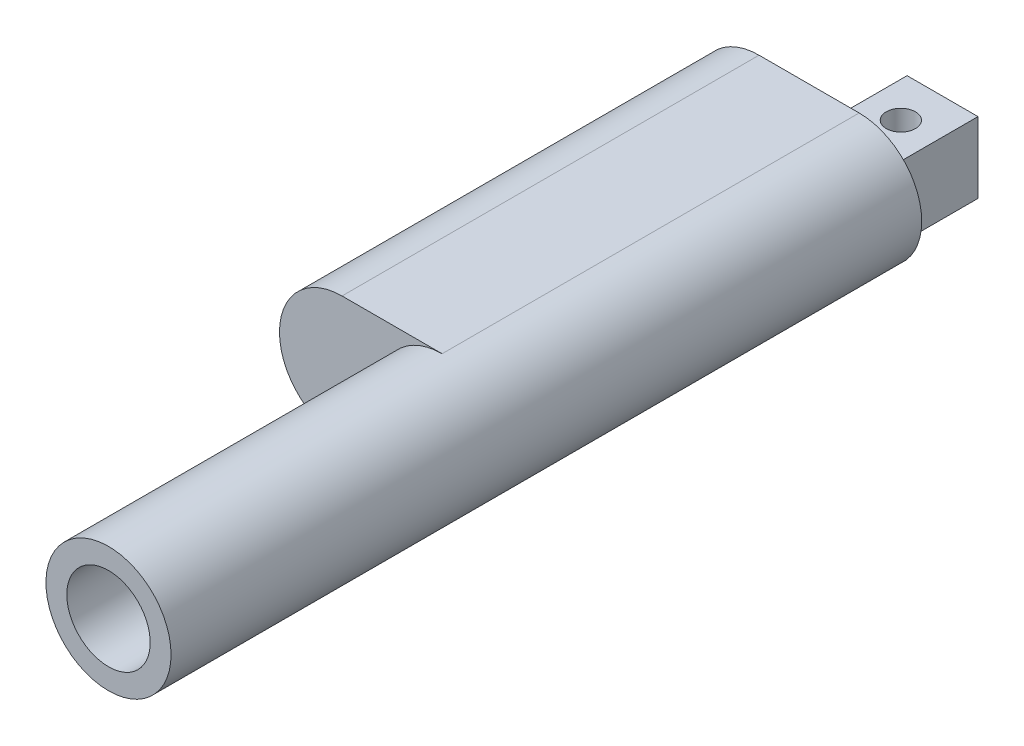
ISO-10303-21;
HEADER;
FILE_DESCRIPTION(('STEP AP214'),'2;1');
FILE_NAME('part.step','',(''),(''),'','','');
FILE_SCHEMA(('AUTOMOTIVE_DESIGN { 1 0 10303 214 1 1 1 1 }'));
ENDSEC;
DATA;
#1=APPLICATION_CONTEXT('core data for automotive mechanical design processes');
#2=APPLICATION_PROTOCOL_DEFINITION('international standard','automotive_design',2000,#1);
#3=PRODUCT_CONTEXT('',#1,'mechanical');
#4=PRODUCT('Part','Part','',(#3));
#5=PRODUCT_RELATED_PRODUCT_CATEGORY('part','',(#4));
#6=PRODUCT_DEFINITION_FORMATION('','',#4);
#7=PRODUCT_DEFINITION_CONTEXT('part definition',#1,'design');
#8=PRODUCT_DEFINITION('design','',#6,#7);
#9=PRODUCT_DEFINITION_SHAPE('','',#8);
#10=(LENGTH_UNIT() NAMED_UNIT(*) SI_UNIT(.MILLI.,.METRE.));
#11=(NAMED_UNIT(*) PLANE_ANGLE_UNIT() SI_UNIT($,.RADIAN.));
#12=(NAMED_UNIT(*) SI_UNIT($,.STERADIAN.) SOLID_ANGLE_UNIT());
#13=UNCERTAINTY_MEASURE_WITH_UNIT(LENGTH_MEASURE(1.E-05),#10,'distance_accuracy_value','');
#14=(GEOMETRIC_REPRESENTATION_CONTEXT(3) GLOBAL_UNCERTAINTY_ASSIGNED_CONTEXT((#13)) GLOBAL_UNIT_ASSIGNED_CONTEXT((#10,
#11,#12)) REPRESENTATION_CONTEXT('',''));
#15=CARTESIAN_POINT('',(0.,0.,0.));
#16=DIRECTION('',(0.,0.,1.));
#17=DIRECTION('',(1.,0.,0.));
#18=AXIS2_PLACEMENT_3D('',#15,#16,#17);
#19=CARTESIAN_POINT('',(0.,0.,0.));
#20=DIRECTION('',(0.,0.,1.));
#21=DIRECTION('',(1.,0.,0.));
#22=AXIS2_PLACEMENT_3D('',#19,#20,#21);
#23=PLANE('',#22);
#24=CARTESIAN_POINT('',(0.,0.,0.));
#25=DIRECTION('',(0.,0.,1.));
#26=DIRECTION('',(1.,0.,0.));
#27=AXIS2_PLACEMENT_3D('',#24,#25,#26);
#28=CIRCLE('',#27,15.);
#29=CARTESIAN_POINT('',(0.,-15.,0.));
#30=VERTEX_POINT('',#29);
#31=CARTESIAN_POINT('',(0.,15.,0.));
#32=VERTEX_POINT('',#31);
#33=EDGE_CURVE('E50',#30,#32,#28,.T.);
#34=ORIENTED_EDGE('',*,*,#33,.F.);
#35=DIRECTION('',(-1.,0.,0.));
#36=VECTOR('',#35,1.);
#37=CARTESIAN_POINT('',(0.,-15.,0.));
#38=LINE('',#37,#36);
#39=CARTESIAN_POINT('',(-24.,-15.,0.));
#40=VERTEX_POINT('',#39);
#41=EDGE_CURVE('E128',#30,#40,#38,.T.);
#42=ORIENTED_EDGE('',*,*,#41,.T.);
#43=CARTESIAN_POINT('',(-24.,0.,0.));
#44=DIRECTION('',(0.,0.,-1.));
#45=DIRECTION('',(-1.,0.,0.));
#46=AXIS2_PLACEMENT_3D('',#43,#44,#45);
#47=CIRCLE('',#46,15.);
#48=CARTESIAN_POINT('',(-24.,15.,0.));
#49=VERTEX_POINT('',#48);
#50=EDGE_CURVE('E131',#40,#49,#47,.T.);
#51=ORIENTED_EDGE('',*,*,#50,.T.);
#52=DIRECTION('',(1.,0.,0.));
#53=VECTOR('',#52,1.);
#54=CARTESIAN_POINT('',(0.,15.,0.));
#55=LINE('',#54,#53);
#56=EDGE_CURVE('E141',#49,#32,#55,.T.);
#57=ORIENTED_EDGE('',*,*,#56,.T.);
#58=EDGE_LOOP('',(#34,#42,#51,#57));
#59=FACE_BOUND('',#58,.T.);
#60=DIRECTION('',(0.,-1.,0.));
#61=VECTOR('',#60,1.);
#62=CARTESIAN_POINT('',(8.5,8.5,0.));
#63=LINE('',#62,#61);
#64=CARTESIAN_POINT('',(8.5,8.5,0.));
#65=VERTEX_POINT('',#64);
#66=CARTESIAN_POINT('',(8.5,-8.5,0.));
#67=VERTEX_POINT('',#66);
#68=EDGE_CURVE('E58',#65,#67,#63,.T.);
#69=ORIENTED_EDGE('',*,*,#68,.F.);
#70=DIRECTION('',(1.,0.,0.));
#71=VECTOR('',#70,1.);
#72=CARTESIAN_POINT('',(8.5,8.5,0.));
#73=LINE('',#72,#71);
#74=CARTESIAN_POINT('',(-8.5,8.5,0.));
#75=VERTEX_POINT('',#74);
#76=EDGE_CURVE('E62',#75,#65,#73,.T.);
#77=ORIENTED_EDGE('',*,*,#76,.F.);
#78=DIRECTION('',(0.,1.,0.));
#79=VECTOR('',#78,1.);
#80=CARTESIAN_POINT('',(-8.5,8.5,0.));
#81=LINE('',#80,#79);
#82=CARTESIAN_POINT('',(-8.5,-8.5,0.));
#83=VERTEX_POINT('',#82);
#84=EDGE_CURVE('E254',#83,#75,#81,.T.);
#85=ORIENTED_EDGE('',*,*,#84,.F.);
#86=DIRECTION('',(-1.,0.,0.));
#87=VECTOR('',#86,1.);
#88=CARTESIAN_POINT('',(8.5,-8.5,0.));
#89=LINE('',#88,#87);
#90=EDGE_CURVE('E246',#67,#83,#89,.T.);
#91=ORIENTED_EDGE('',*,*,#90,.F.);
#92=EDGE_LOOP('',(#69,#77,#85,#91));
#93=FACE_BOUND('',#92,.T.);
#94=ADVANCED_FACE('F41',(#59,#93),#23,.F.);
#95=CARTESIAN_POINT('',(0.,0.,180.));
#96=DIRECTION('',(0.,0.,-1.));
#97=DIRECTION('',(-1.,0.,0.));
#98=AXIS2_PLACEMENT_3D('',#95,#96,#97);
#99=CYLINDRICAL_SURFACE('',#98,15.);
#100=CARTESIAN_POINT('',(0.,0.,180.));
#101=DIRECTION('',(0.,0.,1.));
#102=DIRECTION('',(1.,0.,0.));
#103=AXIS2_PLACEMENT_3D('',#100,#101,#102);
#104=CIRCLE('',#103,15.);
#105=CARTESIAN_POINT('',(15.,0.,180.));
#106=VERTEX_POINT('',#105);
#107=EDGE_CURVE('E11',#106,#106,#104,.T.);
#108=ORIENTED_EDGE('',*,*,#107,.F.);
#109=EDGE_LOOP('',(#108));
#110=FACE_BOUND('',#109,.T.);
#111=CARTESIAN_POINT('',(0.,0.,100.));
#112=DIRECTION('',(0.,0.,-1.));
#113=DIRECTION('',(-1.,0.,0.));
#114=AXIS2_PLACEMENT_3D('',#111,#112,#113);
#115=CIRCLE('',#114,15.);
#116=CARTESIAN_POINT('',(0.,-15.,100.));
#117=VERTEX_POINT('',#116);
#118=CARTESIAN_POINT('',(0.,15.,100.));
#119=VERTEX_POINT('',#118);
#120=EDGE_CURVE('E161',#117,#119,#115,.T.);
#121=ORIENTED_EDGE('',*,*,#120,.F.);
#122=DIRECTION('',(0.,0.,-1.));
#123=VECTOR('',#122,1.);
#124=CARTESIAN_POINT('',(0.,-15.,100.));
#125=LINE('',#124,#123);
#126=EDGE_CURVE('E146',#117,#30,#125,.T.);
#127=ORIENTED_EDGE('',*,*,#126,.T.);
#128=ORIENTED_EDGE('',*,*,#33,.T.);
#129=DIRECTION('',(0.,0.,-1.));
#130=VECTOR('',#129,1.);
#131=CARTESIAN_POINT('',(0.,15.,100.));
#132=LINE('',#131,#130);
#133=EDGE_CURVE('E152',#119,#32,#132,.T.);
#134=ORIENTED_EDGE('',*,*,#133,.F.);
#135=EDGE_LOOP('',(#121,#127,#128,#134));
#136=FACE_BOUND('',#135,.T.);
#137=ADVANCED_FACE('F43',(#110,#136),#99,.T.);
#138=CARTESIAN_POINT('',(0.,0.,180.));
#139=DIRECTION('',(0.,0.,-1.));
#140=DIRECTION('',(-1.,0.,0.));
#141=AXIS2_PLACEMENT_3D('',#138,#139,#140);
#142=CYLINDRICAL_SURFACE('',#141,10.);
#143=CARTESIAN_POINT('',(0.,0.,180.));
#144=DIRECTION('',(0.,0.,1.));
#145=DIRECTION('',(1.,0.,0.));
#146=AXIS2_PLACEMENT_3D('',#143,#144,#145);
#147=CIRCLE('',#146,10.);
#148=CARTESIAN_POINT('',(-10.,0.,180.));
#149=VERTEX_POINT('',#148);
#150=EDGE_CURVE('E164',#149,#149,#147,.T.);
#151=CARTESIAN_POINT('',(0.,0.,100.));
#152=DIRECTION('',(0.,0.,-1.));
#153=DIRECTION('',(-1.,0.,0.));
#154=AXIS2_PLACEMENT_3D('',#151,#152,#153);
#155=CIRCLE('',#154,10.);
#156=CARTESIAN_POINT('',(-10.,0.,100.));
#157=VERTEX_POINT('',#156);
#158=EDGE_CURVE('E45',#157,#157,#155,.T.);
#159=CARTESIAN_POINT('',(-10.,0.,180.));
#160=CARTESIAN_POINT('',(-10.,0.,179.166666666667));
#161=CARTESIAN_POINT('',(-10.,0.,178.333333333333));
#162=CARTESIAN_POINT('',(-10.,0.,176.666666666667));
#163=CARTESIAN_POINT('',(-10.,0.,175.833333333333));
#164=CARTESIAN_POINT('',(-10.,0.,174.166666666667));
#165=CARTESIAN_POINT('',(-10.,0.,173.333333333333));
#166=CARTESIAN_POINT('',(-10.,0.,171.666666666667));
#167=CARTESIAN_POINT('',(-10.,0.,170.833333333333));
#168=CARTESIAN_POINT('',(-10.,0.,169.166666666667));
#169=CARTESIAN_POINT('',(-10.,0.,168.333333333333));
#170=CARTESIAN_POINT('',(-10.,0.,166.666666666667));
#171=CARTESIAN_POINT('',(-10.,0.,165.833333333333));
#172=CARTESIAN_POINT('',(-10.,0.,164.166666666667));
#173=CARTESIAN_POINT('',(-10.,0.,163.333333333333));
#174=CARTESIAN_POINT('',(-10.,0.,161.666666666667));
#175=CARTESIAN_POINT('',(-10.,0.,160.833333333333));
#176=CARTESIAN_POINT('',(-10.,0.,159.166666666667));
#177=CARTESIAN_POINT('',(-10.,0.,158.333333333333));
#178=CARTESIAN_POINT('',(-10.,0.,156.666666666667));
#179=CARTESIAN_POINT('',(-10.,0.,155.833333333333));
#180=CARTESIAN_POINT('',(-10.,0.,154.166666666667));
#181=CARTESIAN_POINT('',(-10.,0.,153.333333333333));
#182=CARTESIAN_POINT('',(-10.,0.,151.666666666667));
#183=CARTESIAN_POINT('',(-10.,0.,150.833333333333));
#184=CARTESIAN_POINT('',(-10.,0.,149.166666666667));
#185=CARTESIAN_POINT('',(-10.,0.,148.333333333333));
#186=CARTESIAN_POINT('',(-10.,0.,146.666666666667));
#187=CARTESIAN_POINT('',(-10.,0.,145.833333333333));
#188=CARTESIAN_POINT('',(-10.,0.,144.166666666667));
#189=CARTESIAN_POINT('',(-10.,0.,143.333333333333));
#190=CARTESIAN_POINT('',(-10.,0.,141.666666666667));
#191=CARTESIAN_POINT('',(-10.,0.,140.833333333333));
#192=CARTESIAN_POINT('',(-10.,0.,139.166666666667));
#193=CARTESIAN_POINT('',(-10.,0.,138.333333333333));
#194=CARTESIAN_POINT('',(-10.,0.,136.666666666667));
#195=CARTESIAN_POINT('',(-10.,0.,135.833333333333));
#196=CARTESIAN_POINT('',(-10.,0.,134.166666666667));
#197=CARTESIAN_POINT('',(-10.,0.,133.333333333333));
#198=CARTESIAN_POINT('',(-10.,0.,131.666666666667));
#199=CARTESIAN_POINT('',(-10.,0.,130.833333333333));
#200=CARTESIAN_POINT('',(-10.,0.,129.166666666667));
#201=CARTESIAN_POINT('',(-10.,0.,128.333333333333));
#202=CARTESIAN_POINT('',(-10.,0.,126.666666666667));
#203=CARTESIAN_POINT('',(-10.,0.,125.833333333333));
#204=CARTESIAN_POINT('',(-10.,0.,124.166666666667));
#205=CARTESIAN_POINT('',(-10.,0.,123.333333333333));
#206=CARTESIAN_POINT('',(-10.,0.,121.666666666667));
#207=CARTESIAN_POINT('',(-10.,0.,120.833333333333));
#208=CARTESIAN_POINT('',(-10.,0.,119.166666666667));
#209=CARTESIAN_POINT('',(-10.,0.,118.333333333333));
#210=CARTESIAN_POINT('',(-10.,0.,116.666666666667));
#211=CARTESIAN_POINT('',(-10.,0.,115.833333333333));
#212=CARTESIAN_POINT('',(-10.,0.,114.166666666667));
#213=CARTESIAN_POINT('',(-10.,0.,113.333333333333));
#214=CARTESIAN_POINT('',(-10.,0.,111.666666666667));
#215=CARTESIAN_POINT('',(-10.,0.,110.833333333333));
#216=CARTESIAN_POINT('',(-10.,0.,109.166666666667));
#217=CARTESIAN_POINT('',(-10.,0.,108.333333333333));
#218=CARTESIAN_POINT('',(-10.,0.,106.666666666667));
#219=CARTESIAN_POINT('',(-10.,0.,105.833333333333));
#220=CARTESIAN_POINT('',(-10.,0.,104.166666666667));
#221=CARTESIAN_POINT('',(-10.,0.,103.333333333333));
#222=CARTESIAN_POINT('',(-10.,0.,101.666666666667));
#223=CARTESIAN_POINT('',(-10.,0.,100.833333333333));
#224=CARTESIAN_POINT('',(-10.,0.,100.));
#225=B_SPLINE_CURVE_WITH_KNOTS('',3,(#159,#160,#161,#162,#163,#164,#165,#166,#167,#168,#169,
#170,#171,#172,#173,#174,#175,#176,#177,#178,#179,#180,#181,#182,#183,#184,#185,#186,#187,#188,
#189,#190,#191,#192,#193,#194,#195,#196,#197,#198,#199,#200,#201,#202,#203,#204,#205,#206,#207,
#208,#209,#210,#211,#212,#213,#214,#215,#216,#217,#218,#219,#220,#221,#222,#223,#224),
.UNSPECIFIED.,.F.,.F.,(4,2,2,2,2,2,2,2,2,2,2,2,2,2,2,2,2,2,2,2,2,2,2,2,2,2,2,2,2,2,2,2,4),(0.,
2.5,5.,7.50000000000001,10.,12.5,15.,17.5,20.,22.5,25.,27.5,30.,32.5,35.,37.5,40.,42.5,45.,47.5,
50.,52.5,55.,57.5,60.,62.5,65.,67.5,70.,72.5,75.,77.5,80.),.UNSPECIFIED.);
#226=EDGE_CURVE('BSEAM198',#149,#157,#225,.T.);
#227=ORIENTED_EDGE('',*,*,#150,.T.);
#228=ORIENTED_EDGE('',*,*,#158,.T.);
#229=ORIENTED_EDGE('',*,*,#226,.T.);
#230=ORIENTED_EDGE('',*,*,#226,.F.);
#231=EDGE_LOOP('',(#227,#229,#228,#230));
#232=FACE_BOUND('',#231,.T.);
#233=ADVANCED_FACE('F198',(#232),#142,.F.);
#234=CARTESIAN_POINT('',(0.,0.,180.));
#235=DIRECTION('',(0.,0.,1.));
#236=DIRECTION('',(1.,0.,0.));
#237=AXIS2_PLACEMENT_3D('',#234,#235,#236);
#238=PLANE('',#237);
#239=ORIENTED_EDGE('',*,*,#107,.T.);
#240=EDGE_LOOP('',(#239));
#241=FACE_BOUND('',#240,.T.);
#242=ORIENTED_EDGE('',*,*,#150,.F.);
#243=EDGE_LOOP('',(#242));
#244=FACE_BOUND('',#243,.T.);
#245=ADVANCED_FACE('F201',(#241,#244),#238,.T.);
#246=CARTESIAN_POINT('',(0.,0.,100.));
#247=DIRECTION('',(0.,0.,-1.));
#248=DIRECTION('',(-1.,0.,0.));
#249=AXIS2_PLACEMENT_3D('',#246,#247,#248);
#250=PLANE('',#249);
#251=ORIENTED_EDGE('',*,*,#158,.F.);
#252=EDGE_LOOP('',(#251));
#253=FACE_BOUND('',#252,.T.);
#254=ADVANCED_FACE('F190',(#253),#250,.F.);
#255=CARTESIAN_POINT('',(0.,15.,100.));
#256=DIRECTION('',(0.,1.,0.));
#257=DIRECTION('',(0.,0.,1.));
#258=AXIS2_PLACEMENT_3D('',#255,#256,#257);
#259=PLANE('',#258);
#260=ORIENTED_EDGE('',*,*,#56,.F.);
#261=DIRECTION('',(0.,0.,-1.));
#262=VECTOR('',#261,1.);
#263=CARTESIAN_POINT('',(-24.,15.,100.));
#264=LINE('',#263,#262);
#265=CARTESIAN_POINT('',(-24.,15.,100.));
#266=VERTEX_POINT('',#265);
#267=EDGE_CURVE('E155',#266,#49,#264,.T.);
#268=ORIENTED_EDGE('',*,*,#267,.F.);
#269=DIRECTION('',(1.,0.,0.));
#270=VECTOR('',#269,1.);
#271=CARTESIAN_POINT('',(0.,15.,100.));
#272=LINE('',#271,#270);
#273=EDGE_CURVE('E144',#266,#119,#272,.T.);
#274=ORIENTED_EDGE('',*,*,#273,.T.);
#275=ORIENTED_EDGE('',*,*,#133,.T.);
#276=EDGE_LOOP('',(#260,#268,#274,#275));
#277=FACE_BOUND('',#276,.T.);
#278=ADVANCED_FACE('F172',(#277),#259,.T.);
#279=CARTESIAN_POINT('',(-24.,0.,100.));
#280=DIRECTION('',(0.,0.,-1.));
#281=DIRECTION('',(-1.,0.,0.));
#282=AXIS2_PLACEMENT_3D('',#279,#280,#281);
#283=CYLINDRICAL_SURFACE('',#282,15.);
#284=ORIENTED_EDGE('',*,*,#50,.F.);
#285=DIRECTION('',(0.,0.,-1.));
#286=VECTOR('',#285,1.);
#287=CARTESIAN_POINT('',(-24.,-15.,100.));
#288=LINE('',#287,#286);
#289=CARTESIAN_POINT('',(-24.,-15.,100.));
#290=VERTEX_POINT('',#289);
#291=EDGE_CURVE('E157',#290,#40,#288,.T.);
#292=ORIENTED_EDGE('',*,*,#291,.F.);
#293=CARTESIAN_POINT('',(-24.,0.,100.));
#294=DIRECTION('',(0.,0.,-1.));
#295=DIRECTION('',(-1.,0.,0.));
#296=AXIS2_PLACEMENT_3D('',#293,#294,#295);
#297=CIRCLE('',#296,15.);
#298=EDGE_CURVE('E140',#290,#266,#297,.T.);
#299=ORIENTED_EDGE('',*,*,#298,.T.);
#300=ORIENTED_EDGE('',*,*,#267,.T.);
#301=EDGE_LOOP('',(#284,#292,#299,#300));
#302=FACE_BOUND('',#301,.T.);
#303=ADVANCED_FACE('F176',(#302),#283,.T.);
#304=CARTESIAN_POINT('',(0.,-15.,100.));
#305=DIRECTION('',(0.,-1.,0.));
#306=DIRECTION('',(0.,0.,-1.));
#307=AXIS2_PLACEMENT_3D('',#304,#305,#306);
#308=PLANE('',#307);
#309=ORIENTED_EDGE('',*,*,#41,.F.);
#310=ORIENTED_EDGE('',*,*,#126,.F.);
#311=DIRECTION('',(-1.,0.,0.));
#312=VECTOR('',#311,1.);
#313=CARTESIAN_POINT('',(0.,-15.,100.));
#314=LINE('',#313,#312);
#315=EDGE_CURVE('E137',#117,#290,#314,.T.);
#316=ORIENTED_EDGE('',*,*,#315,.T.);
#317=ORIENTED_EDGE('',*,*,#291,.T.);
#318=EDGE_LOOP('',(#309,#310,#316,#317));
#319=FACE_BOUND('',#318,.T.);
#320=ADVANCED_FACE('F182',(#319),#308,.T.);
#321=ORIENTED_EDGE('',*,*,#315,.F.);
#322=ORIENTED_EDGE('',*,*,#120,.T.);
#323=ORIENTED_EDGE('',*,*,#273,.F.);
#324=ORIENTED_EDGE('',*,*,#298,.F.);
#325=EDGE_LOOP('',(#321,#322,#323,#324));
#326=FACE_BOUND('',#325,.T.);
#327=ADVANCED_FACE('F180',(#326),#250,.F.);
#328=CARTESIAN_POINT('',(8.5,8.5,-20.));
#329=DIRECTION('',(-1.,0.,0.));
#330=DIRECTION('',(0.,-1.,0.));
#331=AXIS2_PLACEMENT_3D('',#328,#329,#330);
#332=PLANE('',#331);
#333=ORIENTED_EDGE('',*,*,#68,.T.);
#334=DIRECTION('',(0.,0.,1.));
#335=VECTOR('',#334,1.);
#336=CARTESIAN_POINT('',(8.5,-8.5,-20.));
#337=LINE('',#336,#335);
#338=CARTESIAN_POINT('',(8.5,-8.5,-20.));
#339=VERTEX_POINT('',#338);
#340=EDGE_CURVE('E111',#339,#67,#337,.T.);
#341=ORIENTED_EDGE('',*,*,#340,.F.);
#342=DIRECTION('',(0.,-1.,0.));
#343=VECTOR('',#342,1.);
#344=CARTESIAN_POINT('',(8.5,8.5,-20.));
#345=LINE('',#344,#343);
#346=CARTESIAN_POINT('',(8.5,8.5,-20.));
#347=VERTEX_POINT('',#346);
#348=EDGE_CURVE('E117',#347,#339,#345,.T.);
#349=ORIENTED_EDGE('',*,*,#348,.F.);
#350=DIRECTION('',(0.,0.,1.));
#351=VECTOR('',#350,1.);
#352=CARTESIAN_POINT('',(8.5,8.5,-20.));
#353=LINE('',#352,#351);
#354=EDGE_CURVE('E251',#347,#65,#353,.T.);
#355=ORIENTED_EDGE('',*,*,#354,.T.);
#356=EDGE_LOOP('',(#333,#341,#349,#355));
#357=FACE_BOUND('',#356,.T.);
#358=ADVANCED_FACE('F127',(#357),#332,.F.);
#359=CARTESIAN_POINT('',(8.5,-8.5,-20.));
#360=DIRECTION('',(0.,1.,0.));
#361=DIRECTION('',(-1.,0.,0.));
#362=AXIS2_PLACEMENT_3D('',#359,#360,#361);
#363=PLANE('',#362);
#364=CARTESIAN_POINT('',(0.,-8.5,-10.));
#365=DIRECTION('',(0.,1.,0.));
#366=DIRECTION('',(-1.,0.,0.));
#367=AXIS2_PLACEMENT_3D('',#364,#365,#366);
#368=CIRCLE('',#367,3.5);
#369=CARTESIAN_POINT('',(-3.5,-8.5,-10.));
#370=VERTEX_POINT('',#369);
#371=EDGE_CURVE('E244',#370,#370,#368,.T.);
#372=ORIENTED_EDGE('',*,*,#371,.T.);
#373=EDGE_LOOP('',(#372));
#374=FACE_BOUND('',#373,.T.);
#375=ORIENTED_EDGE('',*,*,#90,.T.);
#376=DIRECTION('',(0.,0.,1.));
#377=VECTOR('',#376,1.);
#378=CARTESIAN_POINT('',(-8.5,-8.5,-20.));
#379=LINE('',#378,#377);
#380=CARTESIAN_POINT('',(-8.5,-8.5,-20.));
#381=VERTEX_POINT('',#380);
#382=EDGE_CURVE('E113',#381,#83,#379,.T.);
#383=ORIENTED_EDGE('',*,*,#382,.F.);
#384=DIRECTION('',(-1.,0.,0.));
#385=VECTOR('',#384,1.);
#386=CARTESIAN_POINT('',(8.5,-8.5,-20.));
#387=LINE('',#386,#385);
#388=EDGE_CURVE('E106',#339,#381,#387,.T.);
#389=ORIENTED_EDGE('',*,*,#388,.F.);
#390=ORIENTED_EDGE('',*,*,#340,.T.);
#391=EDGE_LOOP('',(#375,#383,#389,#390));
#392=FACE_BOUND('',#391,.T.);
#393=ADVANCED_FACE('F109',(#374,#392),#363,.F.);
#394=CARTESIAN_POINT('',(-8.5,8.5,-20.));
#395=DIRECTION('',(1.,0.,0.));
#396=DIRECTION('',(0.,1.,0.));
#397=AXIS2_PLACEMENT_3D('',#394,#395,#396);
#398=PLANE('',#397);
#399=ORIENTED_EDGE('',*,*,#84,.T.);
#400=DIRECTION('',(0.,0.,1.));
#401=VECTOR('',#400,1.);
#402=CARTESIAN_POINT('',(-8.5,8.5,-20.));
#403=LINE('',#402,#401);
#404=CARTESIAN_POINT('',(-8.5,8.5,-20.));
#405=VERTEX_POINT('',#404);
#406=EDGE_CURVE('E133',#405,#75,#403,.T.);
#407=ORIENTED_EDGE('',*,*,#406,.F.);
#408=DIRECTION('',(0.,1.,0.));
#409=VECTOR('',#408,1.);
#410=CARTESIAN_POINT('',(-8.5,8.5,-20.));
#411=LINE('',#410,#409);
#412=EDGE_CURVE('E116',#381,#405,#411,.T.);
#413=ORIENTED_EDGE('',*,*,#412,.F.);
#414=ORIENTED_EDGE('',*,*,#382,.T.);
#415=EDGE_LOOP('',(#399,#407,#413,#414));
#416=FACE_BOUND('',#415,.T.);
#417=ADVANCED_FACE('F222',(#416),#398,.F.);
#418=CARTESIAN_POINT('',(8.5,8.5,-20.));
#419=DIRECTION('',(0.,-1.,0.));
#420=DIRECTION('',(1.,0.,0.));
#421=AXIS2_PLACEMENT_3D('',#418,#419,#420);
#422=PLANE('',#421);
#423=CARTESIAN_POINT('',(0.,8.5,-10.));
#424=DIRECTION('',(0.,1.,0.));
#425=DIRECTION('',(-1.,0.,0.));
#426=AXIS2_PLACEMENT_3D('',#423,#424,#425);
#427=CIRCLE('',#426,3.5);
#428=CARTESIAN_POINT('',(-3.5,8.5,-10.));
#429=VERTEX_POINT('',#428);
#430=EDGE_CURVE('E241',#429,#429,#427,.T.);
#431=ORIENTED_EDGE('',*,*,#430,.F.);
#432=EDGE_LOOP('',(#431));
#433=FACE_BOUND('',#432,.T.);
#434=ORIENTED_EDGE('',*,*,#76,.T.);
#435=ORIENTED_EDGE('',*,*,#354,.F.);
#436=DIRECTION('',(1.,0.,0.));
#437=VECTOR('',#436,1.);
#438=CARTESIAN_POINT('',(8.5,8.5,-20.));
#439=LINE('',#438,#437);
#440=EDGE_CURVE('E122',#405,#347,#439,.T.);
#441=ORIENTED_EDGE('',*,*,#440,.F.);
#442=ORIENTED_EDGE('',*,*,#406,.T.);
#443=EDGE_LOOP('',(#434,#435,#441,#442));
#444=FACE_BOUND('',#443,.T.);
#445=ADVANCED_FACE('F226',(#433,#444),#422,.F.);
#446=CARTESIAN_POINT('',(0.,0.,-20.));
#447=DIRECTION('',(0.,0.,-1.));
#448=DIRECTION('',(-1.,0.,0.));
#449=AXIS2_PLACEMENT_3D('',#446,#447,#448);
#450=PLANE('',#449);
#451=ORIENTED_EDGE('',*,*,#348,.T.);
#452=ORIENTED_EDGE('',*,*,#388,.T.);
#453=ORIENTED_EDGE('',*,*,#412,.T.);
#454=ORIENTED_EDGE('',*,*,#440,.T.);
#455=EDGE_LOOP('',(#451,#452,#453,#454));
#456=FACE_BOUND('',#455,.T.);
#457=ADVANCED_FACE('F120',(#456),#450,.T.);
#458=CARTESIAN_POINT('',(0.,-11.5,-10.));
#459=DIRECTION('',(0.,1.,0.));
#460=DIRECTION('',(-1.,0.,0.));
#461=AXIS2_PLACEMENT_3D('',#458,#459,#460);
#462=CYLINDRICAL_SURFACE('',#461,3.5);
#463=ORIENTED_EDGE('',*,*,#430,.T.);
#464=EDGE_LOOP('',(#463));
#465=FACE_BOUND('',#464,.T.);
#466=ORIENTED_EDGE('',*,*,#371,.F.);
#467=EDGE_LOOP('',(#466));
#468=FACE_BOUND('',#467,.T.);
#469=ADVANCED_FACE('F233',(#465,#468),#462,.F.);
#470=CLOSED_SHELL('',(#94,#137,#233,#245,#254,#278,#303,#320,#327,#358,#393,#417,#445,#457,#469));
#471=MANIFOLD_SOLID_BREP('B2',#470);
#472=ADVANCED_BREP_SHAPE_REPRESENTATION('',(#18,#471),#14);
#473=SHAPE_DEFINITION_REPRESENTATION(#9,#472);
ENDSEC;
END-ISO-10303-21;
